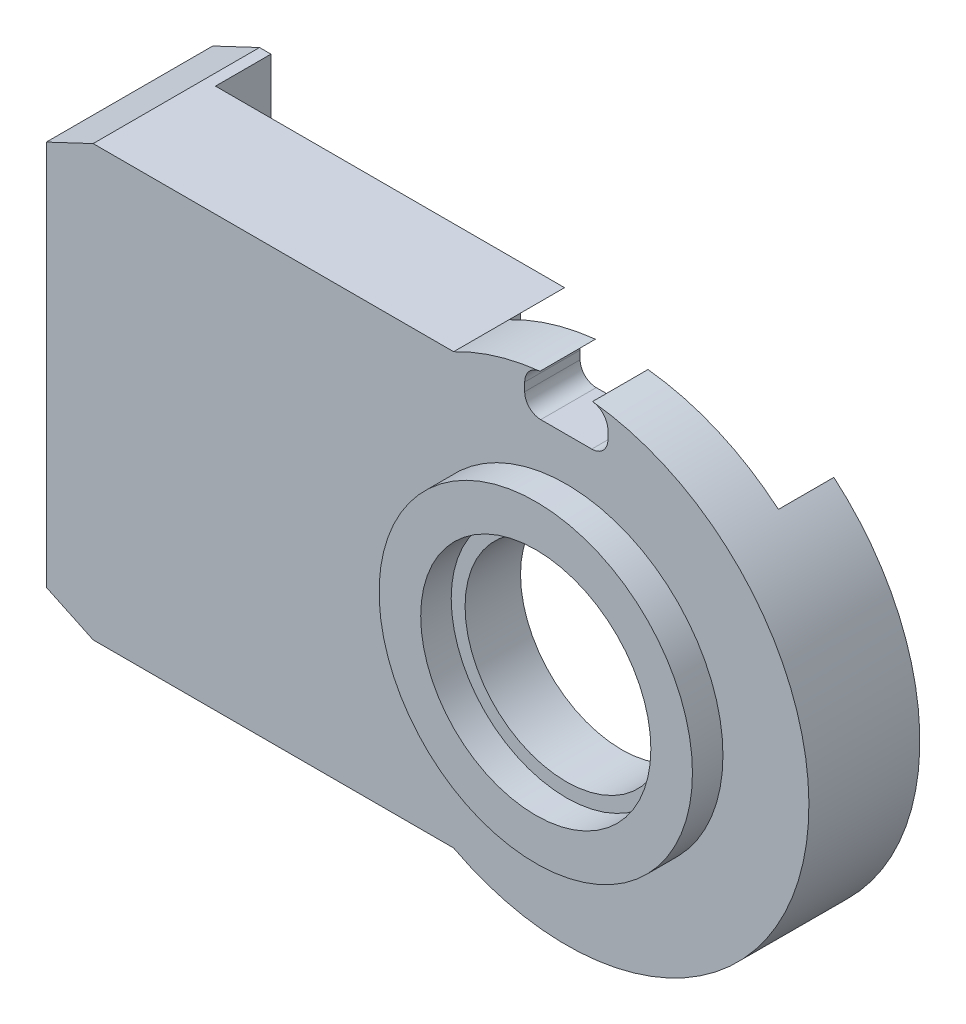
ISO-10303-21;
HEADER;
FILE_DESCRIPTION(('STEP AP214'),'2;1');
FILE_NAME('part.step','',(''),(''),'','','');
FILE_SCHEMA(('AUTOMOTIVE_DESIGN { 1 0 10303 214 1 1 1 1 }'));
ENDSEC;
DATA;
#1=APPLICATION_CONTEXT('core data for automotive mechanical design processes');
#2=APPLICATION_PROTOCOL_DEFINITION('international standard','automotive_design',2000,#1);
#3=PRODUCT_CONTEXT('',#1,'mechanical');
#4=PRODUCT('Part','Part','',(#3));
#5=PRODUCT_RELATED_PRODUCT_CATEGORY('part','',(#4));
#6=PRODUCT_DEFINITION_FORMATION('','',#4);
#7=PRODUCT_DEFINITION_CONTEXT('part definition',#1,'design');
#8=PRODUCT_DEFINITION('design','',#6,#7);
#9=PRODUCT_DEFINITION_SHAPE('','',#8);
#10=(LENGTH_UNIT() NAMED_UNIT(*) SI_UNIT(.MILLI.,.METRE.));
#11=(NAMED_UNIT(*) PLANE_ANGLE_UNIT() SI_UNIT($,.RADIAN.));
#12=(NAMED_UNIT(*) SI_UNIT($,.STERADIAN.) SOLID_ANGLE_UNIT());
#13=UNCERTAINTY_MEASURE_WITH_UNIT(LENGTH_MEASURE(1.E-05),#10,'distance_accuracy_value','');
#14=(GEOMETRIC_REPRESENTATION_CONTEXT(3) GLOBAL_UNCERTAINTY_ASSIGNED_CONTEXT((#13)) GLOBAL_UNIT_ASSIGNED_CONTEXT((#10,
#11,#12)) REPRESENTATION_CONTEXT('',''));
#15=CARTESIAN_POINT('',(0.,0.,0.));
#16=DIRECTION('',(0.,0.,1.));
#17=DIRECTION('',(1.,0.,0.));
#18=AXIS2_PLACEMENT_3D('',#15,#16,#17);
#19=CARTESIAN_POINT('',(0.,0.,4.));
#20=DIRECTION('',(0.,0.,1.));
#21=DIRECTION('',(1.,0.,0.));
#22=AXIS2_PLACEMENT_3D('',#19,#20,#21);
#23=PLANE('',#22);
#24=CARTESIAN_POINT('',(0.,0.,4.));
#25=DIRECTION('',(0.,0.,1.));
#26=DIRECTION('',(1.,0.,0.));
#27=AXIS2_PLACEMENT_3D('',#24,#25,#26);
#28=CIRCLE('',#27,3.65);
#29=CARTESIAN_POINT('',(3.65,0.,4.));
#30=VERTEX_POINT('',#29);
#31=EDGE_CURVE('E361',#30,#30,#28,.T.);
#32=ORIENTED_EDGE('',*,*,#31,.F.);
#33=EDGE_LOOP('',(#32));
#34=FACE_BOUND('',#33,.T.);
#35=CARTESIAN_POINT('',(0.,0.,4.));
#36=DIRECTION('',(0.,0.,1.));
#37=DIRECTION('',(1.,0.,0.));
#38=AXIS2_PLACEMENT_3D('',#35,#36,#37);
#39=CIRCLE('',#38,4.15);
#40=CARTESIAN_POINT('',(4.15,0.,4.));
#41=VERTEX_POINT('',#40);
#42=EDGE_CURVE('E12',#41,#41,#39,.F.);
#43=ORIENTED_EDGE('',*,*,#42,.F.);
#44=EDGE_LOOP('',(#43));
#45=FACE_BOUND('',#44,.T.);
#46=ADVANCED_FACE('F67',(#34,#45),#23,.T.);
#47=CARTESIAN_POINT('',(0.,0.,0.));
#48=DIRECTION('',(0.,0.,1.));
#49=DIRECTION('',(1.,0.,0.));
#50=AXIS2_PLACEMENT_3D('',#47,#48,#49);
#51=PLANE('',#50);
#52=DIRECTION('',(0.,-1.,0.));
#53=VECTOR('',#52,1.);
#54=CARTESIAN_POINT('',(-16.65,0.,0.));
#55=LINE('',#54,#53);
#56=CARTESIAN_POINT('',(-16.65,7.75,0.));
#57=VERTEX_POINT('',#56);
#58=CARTESIAN_POINT('',(-16.65,-7.75,0.));
#59=VERTEX_POINT('',#58);
#60=EDGE_CURVE('E82',#57,#59,#55,.T.);
#61=ORIENTED_EDGE('',*,*,#60,.F.);
#62=DIRECTION('',(1.,0.,0.));
#63=VECTOR('',#62,1.);
#64=CARTESIAN_POINT('',(0.,7.75,0.));
#65=LINE('',#64,#63);
#66=CARTESIAN_POINT('',(-4.06201920231798,7.75,0.));
#67=VERTEX_POINT('',#66);
#68=EDGE_CURVE('E228',#57,#67,#65,.T.);
#69=ORIENTED_EDGE('',*,*,#68,.T.);
#70=CARTESIAN_POINT('',(0.,0.,0.));
#71=DIRECTION('',(0.,0.,1.));
#72=DIRECTION('',(1.,0.,0.));
#73=AXIS2_PLACEMENT_3D('',#70,#71,#72);
#74=CIRCLE('',#73,8.75);
#75=CARTESIAN_POINT('',(-5.65,6.68131723539603,0.));
#76=VERTEX_POINT('',#75);
#77=EDGE_CURVE('E75',#76,#67,#74,.F.);
#78=ORIENTED_EDGE('',*,*,#77,.F.);
#79=DIRECTION('',(0.,-1.,0.));
#80=VECTOR('',#79,1.);
#81=CARTESIAN_POINT('',(-5.65,0.,0.));
#82=LINE('',#81,#80);
#83=CARTESIAN_POINT('',(-5.65,-6.68131723539603,0.));
#84=VERTEX_POINT('',#83);
#85=EDGE_CURVE('E330',#76,#84,#82,.T.);
#86=ORIENTED_EDGE('',*,*,#85,.T.);
#87=CARTESIAN_POINT('',(0.,0.,0.));
#88=DIRECTION('',(0.,0.,1.));
#89=DIRECTION('',(1.,0.,0.));
#90=AXIS2_PLACEMENT_3D('',#87,#88,#89);
#91=CIRCLE('',#90,8.75);
#92=CARTESIAN_POINT('',(-4.06201920231798,-7.75,0.));
#93=VERTEX_POINT('',#92);
#94=EDGE_CURVE('E313',#84,#93,#91,.T.);
#95=ORIENTED_EDGE('',*,*,#94,.T.);
#96=DIRECTION('',(1.,0.,0.));
#97=VECTOR('',#96,1.);
#98=CARTESIAN_POINT('',(0.,-7.75,0.));
#99=LINE('',#98,#97);
#100=EDGE_CURVE('E365',#59,#93,#99,.T.);
#101=ORIENTED_EDGE('',*,*,#100,.F.);
#102=EDGE_LOOP('',(#61,#69,#78,#86,#95,#101));
#103=FACE_BOUND('',#102,.T.);
#104=ADVANCED_FACE('F408',(#103),#51,.F.);
#105=CARTESIAN_POINT('',(0.,0.,4.));
#106=DIRECTION('',(0.,0.,-1.));
#107=DIRECTION('',(-1.,0.,0.));
#108=AXIS2_PLACEMENT_3D('',#105,#106,#107);
#109=CYLINDRICAL_SURFACE('',#108,8.75);
#110=DIRECTION('',(0.,0.,-1.));
#111=VECTOR('',#110,1.);
#112=CARTESIAN_POINT('',(0.947109471094769,8.69859090024141,4.));
#113=LINE('',#112,#111);
#114=CARTESIAN_POINT('',(0.947109471094769,8.69859090024141,4.));
#115=VERTEX_POINT('',#114);
#116=CARTESIAN_POINT('',(0.947109471094767,8.69859090024141,2.));
#117=VERTEX_POINT('',#116);
#118=EDGE_CURVE('E90',#115,#117,#113,.T.);
#119=ORIENTED_EDGE('',*,*,#118,.F.);
#120=CARTESIAN_POINT('',(0.,0.,4.));
#121=DIRECTION('',(0.,0.,1.));
#122=DIRECTION('',(1.,0.,0.));
#123=AXIS2_PLACEMENT_3D('',#120,#121,#122);
#124=CIRCLE('',#123,8.75);
#125=CARTESIAN_POINT('',(-4.06201920231798,-7.75,4.));
#126=VERTEX_POINT('',#125);
#127=EDGE_CURVE('E355',#126,#115,#124,.T.);
#128=ORIENTED_EDGE('',*,*,#127,.F.);
#129=DIRECTION('',(0.,0.,-1.));
#130=VECTOR('',#129,1.);
#131=CARTESIAN_POINT('',(-4.06201920231798,-7.75,4.));
#132=LINE('',#131,#130);
#133=CARTESIAN_POINT('',(-4.06201920231798,-7.75,2.));
#134=VERTEX_POINT('',#133);
#135=EDGE_CURVE('E374',#126,#134,#132,.T.);
#136=ORIENTED_EDGE('',*,*,#135,.T.);
#137=CARTESIAN_POINT('',(0.,0.,2.));
#138=DIRECTION('',(0.,0.,1.));
#139=DIRECTION('',(1.,0.,0.));
#140=AXIS2_PLACEMENT_3D('',#137,#138,#139);
#141=CIRCLE('',#140,8.75);
#142=CARTESIAN_POINT('',(5.65,-6.68131723539602,2.));
#143=VERTEX_POINT('',#142);
#144=EDGE_CURVE('E324',#134,#143,#141,.T.);
#145=ORIENTED_EDGE('',*,*,#144,.T.);
#146=DIRECTION('',(0.,0.,-1.));
#147=VECTOR('',#146,1.);
#148=CARTESIAN_POINT('',(5.65,-6.68131723539602,2.));
#149=LINE('',#148,#147);
#150=CARTESIAN_POINT('',(5.65,-6.68131723539602,0.));
#151=VERTEX_POINT('',#150);
#152=EDGE_CURVE('E328',#143,#151,#149,.T.);
#153=ORIENTED_EDGE('',*,*,#152,.T.);
#154=CARTESIAN_POINT('',(0.,0.,0.));
#155=DIRECTION('',(0.,0.,1.));
#156=DIRECTION('',(1.,0.,0.));
#157=AXIS2_PLACEMENT_3D('',#154,#155,#156);
#158=CIRCLE('',#157,8.75);
#159=CARTESIAN_POINT('',(5.65,6.68131723539603,0.));
#160=VERTEX_POINT('',#159);
#161=EDGE_CURVE('E367',#151,#160,#158,.T.);
#162=ORIENTED_EDGE('',*,*,#161,.T.);
#163=DIRECTION('',(0.,0.,-1.));
#164=VECTOR('',#163,1.);
#165=CARTESIAN_POINT('',(5.65,6.68131723539603,2.));
#166=LINE('',#165,#164);
#167=CARTESIAN_POINT('',(5.65,6.68131723539603,2.));
#168=VERTEX_POINT('',#167);
#169=EDGE_CURVE('E343',#168,#160,#166,.T.);
#170=ORIENTED_EDGE('',*,*,#169,.F.);
#171=CARTESIAN_POINT('',(0.,0.,2.));
#172=DIRECTION('',(0.,0.,1.));
#173=DIRECTION('',(1.,0.,0.));
#174=AXIS2_PLACEMENT_3D('',#171,#172,#173);
#175=CIRCLE('',#174,8.75);
#176=EDGE_CURVE('E317',#168,#117,#175,.T.);
#177=ORIENTED_EDGE('',*,*,#176,.T.);
#178=EDGE_LOOP('',(#119,#128,#136,#145,#153,#162,#170,#177));
#179=FACE_BOUND('',#178,.T.);
#180=ADVANCED_FACE('F417',(#179),#109,.T.);
#181=CARTESIAN_POINT('',(0.,-7.75,4.));
#182=DIRECTION('',(0.,1.,0.));
#183=DIRECTION('',(0.,0.,1.));
#184=AXIS2_PLACEMENT_3D('',#181,#182,#183);
#185=PLANE('',#184);
#186=DIRECTION('',(0.,0.,-1.));
#187=VECTOR('',#186,1.);
#188=CARTESIAN_POINT('',(-17.062019202318,-7.75,4.));
#189=LINE('',#188,#187);
#190=CARTESIAN_POINT('',(-17.062019202318,-7.75,4.));
#191=VERTEX_POINT('',#190);
#192=CARTESIAN_POINT('',(-17.062019202318,-7.75,-2.));
#193=VERTEX_POINT('',#192);
#194=EDGE_CURVE('E383',#191,#193,#189,.T.);
#195=ORIENTED_EDGE('',*,*,#194,.T.);
#196=DIRECTION('',(1.,0.,0.));
#197=VECTOR('',#196,1.);
#198=CARTESIAN_POINT('',(0.,-7.75,-2.));
#199=LINE('',#198,#197);
#200=CARTESIAN_POINT('',(-16.65,-7.75,-2.));
#201=VERTEX_POINT('',#200);
#202=EDGE_CURVE('E231',#193,#201,#199,.T.);
#203=ORIENTED_EDGE('',*,*,#202,.T.);
#204=DIRECTION('',(0.,0.,1.));
#205=VECTOR('',#204,1.);
#206=CARTESIAN_POINT('',(-16.65,-7.75,-2.));
#207=LINE('',#206,#205);
#208=EDGE_CURVE('E230',#201,#59,#207,.T.);
#209=ORIENTED_EDGE('',*,*,#208,.T.);
#210=ORIENTED_EDGE('',*,*,#100,.T.);
#211=DIRECTION('',(0.,0.,-1.));
#212=VECTOR('',#211,1.);
#213=CARTESIAN_POINT('',(-4.06201920231798,-7.75,2.));
#214=LINE('',#213,#212);
#215=EDGE_CURVE('E345',#134,#93,#214,.T.);
#216=ORIENTED_EDGE('',*,*,#215,.F.);
#217=ORIENTED_EDGE('',*,*,#135,.F.);
#218=DIRECTION('',(1.,0.,0.));
#219=VECTOR('',#218,1.);
#220=CARTESIAN_POINT('',(0.,-7.75,4.));
#221=LINE('',#220,#219);
#222=EDGE_CURVE('E351',#191,#126,#221,.T.);
#223=ORIENTED_EDGE('',*,*,#222,.F.);
#224=EDGE_LOOP('',(#195,#203,#209,#210,#216,#217,#223));
#225=FACE_BOUND('',#224,.T.);
#226=ADVANCED_FACE('F413',(#225),#185,.F.);
#227=CARTESIAN_POINT('',(0.,7.75,4.));
#228=DIRECTION('',(0.,1.,0.));
#229=DIRECTION('',(0.,0.,1.));
#230=AXIS2_PLACEMENT_3D('',#227,#228,#229);
#231=PLANE('',#230);
#232=ORIENTED_EDGE('',*,*,#68,.F.);
#233=DIRECTION('',(0.,0.,1.));
#234=VECTOR('',#233,1.);
#235=CARTESIAN_POINT('',(-16.65,7.75,-2.));
#236=LINE('',#235,#234);
#237=CARTESIAN_POINT('',(-16.65,7.75,-2.));
#238=VERTEX_POINT('',#237);
#239=EDGE_CURVE('E225',#238,#57,#236,.T.);
#240=ORIENTED_EDGE('',*,*,#239,.F.);
#241=DIRECTION('',(1.,0.,0.));
#242=VECTOR('',#241,1.);
#243=CARTESIAN_POINT('',(0.,7.75,-2.));
#244=LINE('',#243,#242);
#245=CARTESIAN_POINT('',(-17.062019202318,7.75,-2.));
#246=VERTEX_POINT('',#245);
#247=EDGE_CURVE('E211',#246,#238,#244,.T.);
#248=ORIENTED_EDGE('',*,*,#247,.F.);
#249=DIRECTION('',(0.,0.,-1.));
#250=VECTOR('',#249,1.);
#251=CARTESIAN_POINT('',(-17.062019202318,7.75,4.));
#252=LINE('',#251,#250);
#253=CARTESIAN_POINT('',(-17.062019202318,7.75,4.));
#254=VERTEX_POINT('',#253);
#255=EDGE_CURVE('E368',#254,#246,#252,.T.);
#256=ORIENTED_EDGE('',*,*,#255,.F.);
#257=DIRECTION('',(1.,0.,0.));
#258=VECTOR('',#257,1.);
#259=CARTESIAN_POINT('',(0.,7.75,4.));
#260=LINE('',#259,#258);
#261=CARTESIAN_POINT('',(-4.06201920231798,7.75,4.));
#262=VERTEX_POINT('',#261);
#263=EDGE_CURVE('E358',#254,#262,#260,.T.);
#264=ORIENTED_EDGE('',*,*,#263,.T.);
#265=DIRECTION('',(0.,0.,-1.));
#266=VECTOR('',#265,1.);
#267=CARTESIAN_POINT('',(-4.06201920231798,7.75,4.));
#268=LINE('',#267,#266);
#269=CARTESIAN_POINT('',(-4.06201920231798,7.75,2.));
#270=VERTEX_POINT('',#269);
#271=EDGE_CURVE('E364',#262,#270,#268,.T.);
#272=ORIENTED_EDGE('',*,*,#271,.T.);
#273=DIRECTION('',(0.,0.,-1.));
#274=VECTOR('',#273,1.);
#275=CARTESIAN_POINT('',(-4.06201920231798,7.75,2.));
#276=LINE('',#275,#274);
#277=EDGE_CURVE('E348',#270,#67,#276,.T.);
#278=ORIENTED_EDGE('',*,*,#277,.T.);
#279=EDGE_LOOP('',(#232,#240,#248,#256,#264,#272,#278));
#280=FACE_BOUND('',#279,.T.);
#281=ADVANCED_FACE('F226',(#280),#231,.T.);
#282=CARTESIAN_POINT('',(0.,0.,4.));
#283=DIRECTION('',(0.,0.,-1.));
#284=DIRECTION('',(-1.,0.,0.));
#285=AXIS2_PLACEMENT_3D('',#282,#283,#284);
#286=CYLINDRICAL_SURFACE('',#285,3.65);
#287=CARTESIAN_POINT('',(0.,0.,2.));
#288=DIRECTION('',(0.,0.,1.));
#289=DIRECTION('',(1.,0.,0.));
#290=AXIS2_PLACEMENT_3D('',#287,#288,#289);
#291=CIRCLE('',#290,3.65);
#292=CARTESIAN_POINT('',(3.65,0.,2.));
#293=VERTEX_POINT('',#292);
#294=EDGE_CURVE('E309',#293,#293,#291,.T.);
#295=ORIENTED_EDGE('',*,*,#294,.F.);
#296=EDGE_LOOP('',(#295));
#297=FACE_BOUND('',#296,.T.);
#298=ORIENTED_EDGE('',*,*,#31,.T.);
#299=EDGE_LOOP('',(#298));
#300=FACE_BOUND('',#299,.T.);
#301=ADVANCED_FACE('F472',(#297,#300),#286,.F.);
#302=CARTESIAN_POINT('',(-0.947109471094651,8.69859090024142,4.));
#303=VERTEX_POINT('',#302);
#304=EDGE_CURVE('E354',#303,#262,#124,.T.);
#305=ORIENTED_EDGE('',*,*,#304,.F.);
#306=DIRECTION('',(0.,0.,-1.));
#307=VECTOR('',#306,1.);
#308=CARTESIAN_POINT('',(-0.947109471094651,8.69859090024142,4.));
#309=LINE('',#308,#307);
#310=CARTESIAN_POINT('',(-0.947109471094651,8.69859090024142,2.));
#311=VERTEX_POINT('',#310);
#312=EDGE_CURVE('E292',#303,#311,#309,.T.);
#313=ORIENTED_EDGE('',*,*,#312,.T.);
#314=EDGE_CURVE('E321',#311,#270,#175,.T.);
#315=ORIENTED_EDGE('',*,*,#314,.T.);
#316=ORIENTED_EDGE('',*,*,#271,.F.);
#317=EDGE_LOOP('',(#305,#313,#315,#316));
#318=FACE_BOUND('',#317,.T.);
#319=ADVANCED_FACE('F399',(#318),#109,.T.);
#320=ORIENTED_EDGE('',*,*,#161,.F.);
#321=DIRECTION('',(0.,-1.,0.));
#322=VECTOR('',#321,1.);
#323=CARTESIAN_POINT('',(5.65,0.,0.));
#324=LINE('',#323,#322);
#325=EDGE_CURVE('E295',#160,#151,#324,.T.);
#326=ORIENTED_EDGE('',*,*,#325,.F.);
#327=EDGE_LOOP('',(#320,#326));
#328=FACE_BOUND('',#327,.T.);
#329=ADVANCED_FACE('F463',(#328),#51,.F.);
#330=CARTESIAN_POINT('',(0.,0.,4.));
#331=DIRECTION('',(0.,0.,1.));
#332=DIRECTION('',(1.,0.,0.));
#333=AXIS2_PLACEMENT_3D('',#330,#331,#332);
#334=CIRCLE('',#333,5.65);
#335=CARTESIAN_POINT('',(5.65,0.,4.));
#336=VERTEX_POINT('',#335);
#337=EDGE_CURVE('E240',#336,#336,#334,.T.);
#338=ORIENTED_EDGE('',*,*,#337,.F.);
#339=EDGE_LOOP('',(#338));
#340=FACE_BOUND('',#339,.T.);
#341=CARTESIAN_POINT('',(-0.879999999999943,8.08223360216717,4.));
#342=DIRECTION('',(0.,0.,-1.));
#343=DIRECTION('',(1.,0.,0.));
#344=AXIS2_PLACEMENT_3D('',#341,#342,#343);
#345=CIRCLE('',#344,0.620000000000002);
#346=CARTESIAN_POINT('',(-1.49999999999995,8.08223360216717,4.));
#347=VERTEX_POINT('',#346);
#348=EDGE_CURVE('E272',#347,#303,#345,.T.);
#349=ORIENTED_EDGE('',*,*,#348,.T.);
#350=ORIENTED_EDGE('',*,*,#304,.T.);
#351=ORIENTED_EDGE('',*,*,#263,.F.);
#352=DIRECTION('',(-0.904313023333706,-0.426869951892907,0.));
#353=VECTOR('',#352,1.);
#354=CARTESIAN_POINT('',(-17.062019202318,7.75,4.));
#355=LINE('',#354,#353);
#356=CARTESIAN_POINT('',(-18.75,6.95320921704035,4.));
#357=VERTEX_POINT('',#356);
#358=EDGE_CURVE('E381',#254,#357,#355,.T.);
#359=ORIENTED_EDGE('',*,*,#358,.T.);
#360=DIRECTION('',(0.,-1.,0.));
#361=VECTOR('',#360,1.);
#362=CARTESIAN_POINT('',(-18.75,6.95320921704035,4.));
#363=LINE('',#362,#361);
#364=CARTESIAN_POINT('',(-18.75,-6.95320921704035,4.));
#365=VERTEX_POINT('',#364);
#366=EDGE_CURVE('E379',#357,#365,#363,.T.);
#367=ORIENTED_EDGE('',*,*,#366,.T.);
#368=DIRECTION('',(-0.904313023333706,0.426869951892907,0.));
#369=VECTOR('',#368,1.);
#370=CARTESIAN_POINT('',(-17.062019202318,-7.75,4.));
#371=LINE('',#370,#369);
#372=EDGE_CURVE('E350',#191,#365,#371,.T.);
#373=ORIENTED_EDGE('',*,*,#372,.F.);
#374=ORIENTED_EDGE('',*,*,#222,.T.);
#375=ORIENTED_EDGE('',*,*,#127,.T.);
#376=CARTESIAN_POINT('',(0.880000000000052,8.08223360216716,4.));
#377=DIRECTION('',(0.,0.,-1.));
#378=DIRECTION('',(-1.,0.,0.));
#379=AXIS2_PLACEMENT_3D('',#376,#377,#378);
#380=CIRCLE('',#379,0.620000000000003);
#381=CARTESIAN_POINT('',(1.50000000000005,8.08223360216716,4.));
#382=VERTEX_POINT('',#381);
#383=EDGE_CURVE('E253',#115,#382,#380,.T.);
#384=ORIENTED_EDGE('',*,*,#383,.T.);
#385=DIRECTION('',(0.,-1.,0.));
#386=VECTOR('',#385,1.);
#387=CARTESIAN_POINT('',(1.50000000000005,7.77999999999999,4.));
#388=LINE('',#387,#386);
#389=CARTESIAN_POINT('',(1.50000000000005,7.77999999999999,4.));
#390=VERTEX_POINT('',#389);
#391=EDGE_CURVE('E256',#382,#390,#388,.T.);
#392=ORIENTED_EDGE('',*,*,#391,.T.);
#393=CARTESIAN_POINT('',(0.920000000000056,7.77999999999999,4.));
#394=DIRECTION('',(0.,0.,-1.));
#395=DIRECTION('',(-1.,0.,0.));
#396=AXIS2_PLACEMENT_3D('',#393,#394,#395);
#397=CIRCLE('',#396,0.579999999999998);
#398=CARTESIAN_POINT('',(0.920000000000056,7.2,4.));
#399=VERTEX_POINT('',#398);
#400=EDGE_CURVE('E260',#390,#399,#397,.T.);
#401=ORIENTED_EDGE('',*,*,#400,.T.);
#402=DIRECTION('',(-1.,0.,0.));
#403=VECTOR('',#402,1.);
#404=CARTESIAN_POINT('',(-0.919999999999948,7.2,4.));
#405=LINE('',#404,#403);
#406=CARTESIAN_POINT('',(-0.919999999999948,7.2,4.));
#407=VERTEX_POINT('',#406);
#408=EDGE_CURVE('E263',#399,#407,#405,.T.);
#409=ORIENTED_EDGE('',*,*,#408,.T.);
#410=CARTESIAN_POINT('',(-0.919999999999948,7.77999999999999,4.));
#411=DIRECTION('',(0.,0.,-1.));
#412=DIRECTION('',(1.,0.,0.));
#413=AXIS2_PLACEMENT_3D('',#410,#411,#412);
#414=CIRCLE('',#413,0.579999999999998);
#415=CARTESIAN_POINT('',(-1.49999999999995,7.77999999999999,4.));
#416=VERTEX_POINT('',#415);
#417=EDGE_CURVE('E266',#407,#416,#414,.T.);
#418=ORIENTED_EDGE('',*,*,#417,.T.);
#419=DIRECTION('',(0.,1.,0.));
#420=VECTOR('',#419,1.);
#421=CARTESIAN_POINT('',(-1.49999999999995,7.77999999999999,4.));
#422=LINE('',#421,#420);
#423=EDGE_CURVE('E269',#416,#347,#422,.T.);
#424=ORIENTED_EDGE('',*,*,#423,.T.);
#425=EDGE_LOOP('',(#349,#350,#351,#359,#367,#373,#374,#375,#384,#392,#401,#409,#418,#424));
#426=FACE_BOUND('',#425,.T.);
#427=ADVANCED_FACE('F420',(#340,#426),#23,.T.);
#428=CARTESIAN_POINT('',(-17.062019202318,7.75,4.));
#429=DIRECTION('',(0.426869951892907,-0.904313023333706,0.));
#430=DIRECTION('',(0.904313023333706,0.426869951892907,0.));
#431=AXIS2_PLACEMENT_3D('',#428,#429,#430);
#432=PLANE('',#431);
#433=ORIENTED_EDGE('',*,*,#255,.T.);
#434=DIRECTION('',(-0.904313023333706,-0.426869951892907,0.));
#435=VECTOR('',#434,1.);
#436=CARTESIAN_POINT('',(-6.10069270130348,12.9241607114331,-2.));
#437=LINE('',#436,#435);
#438=CARTESIAN_POINT('',(-18.75,6.95320921704035,-2.));
#439=VERTEX_POINT('',#438);
#440=EDGE_CURVE('E220',#246,#439,#437,.T.);
#441=ORIENTED_EDGE('',*,*,#440,.T.);
#442=DIRECTION('',(0.,0.,-1.));
#443=VECTOR('',#442,1.);
#444=CARTESIAN_POINT('',(-18.75,6.95320921704035,4.));
#445=LINE('',#444,#443);
#446=EDGE_CURVE('E385',#357,#439,#445,.T.);
#447=ORIENTED_EDGE('',*,*,#446,.F.);
#448=ORIENTED_EDGE('',*,*,#358,.F.);
#449=EDGE_LOOP('',(#433,#441,#447,#448));
#450=FACE_BOUND('',#449,.T.);
#451=ADVANCED_FACE('F431',(#450),#432,.F.);
#452=CARTESIAN_POINT('',(-18.75,6.95320921704035,4.));
#453=DIRECTION('',(1.,0.,0.));
#454=DIRECTION('',(0.,0.,-1.));
#455=AXIS2_PLACEMENT_3D('',#452,#453,#454);
#456=PLANE('',#455);
#457=ORIENTED_EDGE('',*,*,#446,.T.);
#458=DIRECTION('',(0.,-1.,0.));
#459=VECTOR('',#458,1.);
#460=CARTESIAN_POINT('',(-18.75,0.,-2.));
#461=LINE('',#460,#459);
#462=CARTESIAN_POINT('',(-18.75,-6.95320921704035,-2.));
#463=VERTEX_POINT('',#462);
#464=EDGE_CURVE('E244',#439,#463,#461,.T.);
#465=ORIENTED_EDGE('',*,*,#464,.T.);
#466=DIRECTION('',(0.,0.,-1.));
#467=VECTOR('',#466,1.);
#468=CARTESIAN_POINT('',(-18.75,-6.95320921704035,4.));
#469=LINE('',#468,#467);
#470=EDGE_CURVE('E387',#365,#463,#469,.T.);
#471=ORIENTED_EDGE('',*,*,#470,.F.);
#472=ORIENTED_EDGE('',*,*,#366,.F.);
#473=EDGE_LOOP('',(#457,#465,#471,#472));
#474=FACE_BOUND('',#473,.T.);
#475=ADVANCED_FACE('F426',(#474),#456,.F.);
#476=CARTESIAN_POINT('',(-17.062019202318,-7.75,4.));
#477=DIRECTION('',(-0.426869951892907,-0.904313023333706,0.));
#478=DIRECTION('',(0.904313023333706,-0.426869951892907,0.));
#479=AXIS2_PLACEMENT_3D('',#476,#477,#478);
#480=PLANE('',#479);
#481=ORIENTED_EDGE('',*,*,#470,.T.);
#482=DIRECTION('',(-0.904313023333706,0.426869951892907,0.));
#483=VECTOR('',#482,1.);
#484=CARTESIAN_POINT('',(-6.10069270130348,-12.9241607114331,-2.));
#485=LINE('',#484,#483);
#486=EDGE_CURVE('E247',#193,#463,#485,.T.);
#487=ORIENTED_EDGE('',*,*,#486,.F.);
#488=ORIENTED_EDGE('',*,*,#194,.F.);
#489=ORIENTED_EDGE('',*,*,#372,.T.);
#490=EDGE_LOOP('',(#481,#487,#488,#489));
#491=FACE_BOUND('',#490,.T.);
#492=ADVANCED_FACE('F69',(#491),#480,.T.);
#493=CARTESIAN_POINT('',(0.,0.,2.));
#494=DIRECTION('',(0.,0.,-1.));
#495=DIRECTION('',(-1.,0.,0.));
#496=AXIS2_PLACEMENT_3D('',#493,#494,#495);
#497=CYLINDRICAL_SURFACE('',#496,8.75);
#498=ORIENTED_EDGE('',*,*,#215,.T.);
#499=ORIENTED_EDGE('',*,*,#94,.F.);
#500=DIRECTION('',(0.,0.,-1.));
#501=VECTOR('',#500,1.);
#502=CARTESIAN_POINT('',(-5.65,-6.68131723539603,2.));
#503=LINE('',#502,#501);
#504=CARTESIAN_POINT('',(-5.65,-6.68131723539603,2.));
#505=VERTEX_POINT('',#504);
#506=EDGE_CURVE('E337',#505,#84,#503,.T.);
#507=ORIENTED_EDGE('',*,*,#506,.F.);
#508=EDGE_CURVE('E325',#505,#134,#141,.T.);
#509=ORIENTED_EDGE('',*,*,#508,.T.);
#510=EDGE_LOOP('',(#498,#499,#507,#509));
#511=FACE_BOUND('',#510,.T.);
#512=ADVANCED_FACE('F410',(#511),#497,.F.);
#513=CARTESIAN_POINT('',(5.65,0.,2.));
#514=DIRECTION('',(1.,0.,0.));
#515=DIRECTION('',(0.,0.,-1.));
#516=AXIS2_PLACEMENT_3D('',#513,#514,#515);
#517=PLANE('',#516);
#518=ORIENTED_EDGE('',*,*,#325,.T.);
#519=ORIENTED_EDGE('',*,*,#152,.F.);
#520=DIRECTION('',(0.,-1.,0.));
#521=VECTOR('',#520,1.);
#522=CARTESIAN_POINT('',(5.65,0.,2.));
#523=LINE('',#522,#521);
#524=EDGE_CURVE('E312',#168,#143,#523,.T.);
#525=ORIENTED_EDGE('',*,*,#524,.F.);
#526=ORIENTED_EDGE('',*,*,#169,.T.);
#527=EDGE_LOOP('',(#518,#519,#525,#526));
#528=FACE_BOUND('',#527,.T.);
#529=ADVANCED_FACE('F461',(#528),#517,.F.);
#530=CARTESIAN_POINT('',(0.,0.,2.));
#531=DIRECTION('',(0.,0.,-1.));
#532=DIRECTION('',(-1.,0.,0.));
#533=AXIS2_PLACEMENT_3D('',#530,#531,#532);
#534=CYLINDRICAL_SURFACE('',#533,8.75);
#535=CARTESIAN_POINT('',(-5.65,6.68131723539603,2.));
#536=VERTEX_POINT('',#535);
#537=EDGE_CURVE('E316',#270,#536,#175,.T.);
#538=ORIENTED_EDGE('',*,*,#537,.T.);
#539=DIRECTION('',(0.,0.,-1.));
#540=VECTOR('',#539,1.);
#541=CARTESIAN_POINT('',(-5.65,6.68131723539603,2.));
#542=LINE('',#541,#540);
#543=EDGE_CURVE('E340',#536,#76,#542,.T.);
#544=ORIENTED_EDGE('',*,*,#543,.T.);
#545=ORIENTED_EDGE('',*,*,#77,.T.);
#546=ORIENTED_EDGE('',*,*,#277,.F.);
#547=EDGE_LOOP('',(#538,#544,#545,#546));
#548=FACE_BOUND('',#547,.T.);
#549=ADVANCED_FACE('F393',(#548),#534,.F.);
#550=CARTESIAN_POINT('',(-5.65,0.,2.));
#551=DIRECTION('',(1.,0.,0.));
#552=DIRECTION('',(0.,0.,-1.));
#553=AXIS2_PLACEMENT_3D('',#550,#551,#552);
#554=PLANE('',#553);
#555=ORIENTED_EDGE('',*,*,#85,.F.);
#556=ORIENTED_EDGE('',*,*,#543,.F.);
#557=DIRECTION('',(0.,-1.,0.));
#558=VECTOR('',#557,1.);
#559=CARTESIAN_POINT('',(-5.65,0.,2.));
#560=LINE('',#559,#558);
#561=EDGE_CURVE('E320',#536,#505,#560,.T.);
#562=ORIENTED_EDGE('',*,*,#561,.T.);
#563=ORIENTED_EDGE('',*,*,#506,.T.);
#564=EDGE_LOOP('',(#555,#556,#562,#563));
#565=FACE_BOUND('',#564,.T.);
#566=ADVANCED_FACE('F407',(#565),#554,.T.);
#567=CARTESIAN_POINT('',(0.,0.,2.));
#568=DIRECTION('',(0.,0.,1.));
#569=DIRECTION('',(1.,0.,0.));
#570=AXIS2_PLACEMENT_3D('',#567,#568,#569);
#571=PLANE('',#570);
#572=ORIENTED_EDGE('',*,*,#294,.T.);
#573=EDGE_LOOP('',(#572));
#574=FACE_BOUND('',#573,.T.);
#575=ORIENTED_EDGE('',*,*,#314,.F.);
#576=CARTESIAN_POINT('',(-0.879999999999943,8.08223360216717,2.));
#577=DIRECTION('',(0.,0.,-1.));
#578=DIRECTION('',(1.,0.,0.));
#579=AXIS2_PLACEMENT_3D('',#576,#577,#578);
#580=CIRCLE('',#579,0.620000000000002);
#581=CARTESIAN_POINT('',(-1.49999999999995,8.08223360216717,2.));
#582=VERTEX_POINT('',#581);
#583=EDGE_CURVE('E257',#582,#311,#580,.T.);
#584=ORIENTED_EDGE('',*,*,#583,.F.);
#585=DIRECTION('',(0.,1.,0.));
#586=VECTOR('',#585,1.);
#587=CARTESIAN_POINT('',(-1.49999999999995,7.77999999999999,2.));
#588=LINE('',#587,#586);
#589=CARTESIAN_POINT('',(-1.49999999999995,7.77999999999999,2.));
#590=VERTEX_POINT('',#589);
#591=EDGE_CURVE('E288',#590,#582,#588,.T.);
#592=ORIENTED_EDGE('',*,*,#591,.F.);
#593=CARTESIAN_POINT('',(-0.919999999999948,7.77999999999999,2.));
#594=DIRECTION('',(0.,0.,-1.));
#595=DIRECTION('',(1.,0.,0.));
#596=AXIS2_PLACEMENT_3D('',#593,#594,#595);
#597=CIRCLE('',#596,0.579999999999998);
#598=CARTESIAN_POINT('',(-0.919999999999948,7.2,2.));
#599=VERTEX_POINT('',#598);
#600=EDGE_CURVE('E285',#599,#590,#597,.T.);
#601=ORIENTED_EDGE('',*,*,#600,.F.);
#602=DIRECTION('',(-1.,0.,0.));
#603=VECTOR('',#602,1.);
#604=CARTESIAN_POINT('',(-0.919999999999948,7.2,2.));
#605=LINE('',#604,#603);
#606=CARTESIAN_POINT('',(0.920000000000056,7.2,2.));
#607=VERTEX_POINT('',#606);
#608=EDGE_CURVE('E282',#607,#599,#605,.T.);
#609=ORIENTED_EDGE('',*,*,#608,.F.);
#610=CARTESIAN_POINT('',(0.920000000000056,7.77999999999999,2.));
#611=DIRECTION('',(0.,0.,-1.));
#612=DIRECTION('',(-1.,0.,0.));
#613=AXIS2_PLACEMENT_3D('',#610,#611,#612);
#614=CIRCLE('',#613,0.579999999999998);
#615=CARTESIAN_POINT('',(1.50000000000005,7.77999999999999,2.));
#616=VERTEX_POINT('',#615);
#617=EDGE_CURVE('E279',#616,#607,#614,.T.);
#618=ORIENTED_EDGE('',*,*,#617,.F.);
#619=DIRECTION('',(0.,-1.,0.));
#620=VECTOR('',#619,1.);
#621=CARTESIAN_POINT('',(1.50000000000005,7.77999999999999,2.));
#622=LINE('',#621,#620);
#623=CARTESIAN_POINT('',(1.50000000000005,8.08223360216716,2.));
#624=VERTEX_POINT('',#623);
#625=EDGE_CURVE('E276',#624,#616,#622,.T.);
#626=ORIENTED_EDGE('',*,*,#625,.F.);
#627=CARTESIAN_POINT('',(0.880000000000052,8.08223360216716,2.));
#628=DIRECTION('',(0.,0.,-1.));
#629=DIRECTION('',(-1.,0.,0.));
#630=AXIS2_PLACEMENT_3D('',#627,#628,#629);
#631=CIRCLE('',#630,0.620000000000003);
#632=EDGE_CURVE('E251',#117,#624,#631,.T.);
#633=ORIENTED_EDGE('',*,*,#632,.F.);
#634=ORIENTED_EDGE('',*,*,#176,.F.);
#635=ORIENTED_EDGE('',*,*,#524,.T.);
#636=ORIENTED_EDGE('',*,*,#144,.F.);
#637=ORIENTED_EDGE('',*,*,#508,.F.);
#638=ORIENTED_EDGE('',*,*,#561,.F.);
#639=ORIENTED_EDGE('',*,*,#537,.F.);
#640=EDGE_LOOP('',(#575,#584,#592,#601,#609,#618,#626,#633,#634,#635,#636,#637,#638,#639));
#641=FACE_BOUND('',#640,.T.);
#642=ADVANCED_FACE('F404',(#574,#641),#571,.F.);
#643=CARTESIAN_POINT('',(-0.879999999999943,8.08223360216717,4.));
#644=DIRECTION('',(0.,0.,-1.));
#645=DIRECTION('',(-1.,0.,0.));
#646=AXIS2_PLACEMENT_3D('',#643,#644,#645);
#647=CYLINDRICAL_SURFACE('',#646,0.620000000000002);
#648=ORIENTED_EDGE('',*,*,#583,.T.);
#649=ORIENTED_EDGE('',*,*,#312,.F.);
#650=ORIENTED_EDGE('',*,*,#348,.F.);
#651=DIRECTION('',(0.,0.,-1.));
#652=VECTOR('',#651,1.);
#653=CARTESIAN_POINT('',(-1.49999999999995,8.08223360216717,4.));
#654=LINE('',#653,#652);
#655=EDGE_CURVE('E296',#347,#582,#654,.T.);
#656=ORIENTED_EDGE('',*,*,#655,.T.);
#657=EDGE_LOOP('',(#648,#649,#650,#656));
#658=FACE_BOUND('',#657,.T.);
#659=ADVANCED_FACE('F435',(#658),#647,.F.);
#660=CARTESIAN_POINT('',(-1.49999999999995,7.77999999999999,4.));
#661=DIRECTION('',(-1.,0.,0.));
#662=DIRECTION('',(0.,0.,1.));
#663=AXIS2_PLACEMENT_3D('',#660,#661,#662);
#664=PLANE('',#663);
#665=ORIENTED_EDGE('',*,*,#591,.T.);
#666=ORIENTED_EDGE('',*,*,#655,.F.);
#667=ORIENTED_EDGE('',*,*,#423,.F.);
#668=DIRECTION('',(0.,0.,-1.));
#669=VECTOR('',#668,1.);
#670=CARTESIAN_POINT('',(-1.49999999999995,7.77999999999999,4.));
#671=LINE('',#670,#669);
#672=EDGE_CURVE('E298',#416,#590,#671,.T.);
#673=ORIENTED_EDGE('',*,*,#672,.T.);
#674=EDGE_LOOP('',(#665,#666,#667,#673));
#675=FACE_BOUND('',#674,.T.);
#676=ADVANCED_FACE('F440',(#675),#664,.F.);
#677=CARTESIAN_POINT('',(-0.919999999999948,7.77999999999999,4.));
#678=DIRECTION('',(0.,0.,-1.));
#679=DIRECTION('',(-1.,0.,0.));
#680=AXIS2_PLACEMENT_3D('',#677,#678,#679);
#681=CYLINDRICAL_SURFACE('',#680,0.579999999999998);
#682=ORIENTED_EDGE('',*,*,#600,.T.);
#683=ORIENTED_EDGE('',*,*,#672,.F.);
#684=ORIENTED_EDGE('',*,*,#417,.F.);
#685=DIRECTION('',(0.,0.,-1.));
#686=VECTOR('',#685,1.);
#687=CARTESIAN_POINT('',(-0.919999999999948,7.2,4.));
#688=LINE('',#687,#686);
#689=EDGE_CURVE('E300',#407,#599,#688,.T.);
#690=ORIENTED_EDGE('',*,*,#689,.T.);
#691=EDGE_LOOP('',(#682,#683,#684,#690));
#692=FACE_BOUND('',#691,.T.);
#693=ADVANCED_FACE('F443',(#692),#681,.F.);
#694=CARTESIAN_POINT('',(-0.919999999999948,7.2,4.));
#695=DIRECTION('',(0.,-1.,0.));
#696=DIRECTION('',(0.,0.,-1.));
#697=AXIS2_PLACEMENT_3D('',#694,#695,#696);
#698=PLANE('',#697);
#699=ORIENTED_EDGE('',*,*,#608,.T.);
#700=ORIENTED_EDGE('',*,*,#689,.F.);
#701=ORIENTED_EDGE('',*,*,#408,.F.);
#702=DIRECTION('',(0.,0.,-1.));
#703=VECTOR('',#702,1.);
#704=CARTESIAN_POINT('',(0.920000000000056,7.2,4.));
#705=LINE('',#704,#703);
#706=EDGE_CURVE('E302',#399,#607,#705,.T.);
#707=ORIENTED_EDGE('',*,*,#706,.T.);
#708=EDGE_LOOP('',(#699,#700,#701,#707));
#709=FACE_BOUND('',#708,.T.);
#710=ADVANCED_FACE('F446',(#709),#698,.F.);
#711=CARTESIAN_POINT('',(0.920000000000056,7.77999999999999,4.));
#712=DIRECTION('',(0.,0.,-1.));
#713=DIRECTION('',(-1.,0.,0.));
#714=AXIS2_PLACEMENT_3D('',#711,#712,#713);
#715=CYLINDRICAL_SURFACE('',#714,0.579999999999998);
#716=ORIENTED_EDGE('',*,*,#617,.T.);
#717=ORIENTED_EDGE('',*,*,#706,.F.);
#718=ORIENTED_EDGE('',*,*,#400,.F.);
#719=DIRECTION('',(0.,0.,-1.));
#720=VECTOR('',#719,1.);
#721=CARTESIAN_POINT('',(1.50000000000005,7.77999999999999,4.));
#722=LINE('',#721,#720);
#723=EDGE_CURVE('E304',#390,#616,#722,.T.);
#724=ORIENTED_EDGE('',*,*,#723,.T.);
#725=EDGE_LOOP('',(#716,#717,#718,#724));
#726=FACE_BOUND('',#725,.T.);
#727=ADVANCED_FACE('F450',(#726),#715,.F.);
#728=CARTESIAN_POINT('',(1.50000000000005,7.77999999999999,4.));
#729=DIRECTION('',(1.,0.,0.));
#730=DIRECTION('',(0.,0.,-1.));
#731=AXIS2_PLACEMENT_3D('',#728,#729,#730);
#732=PLANE('',#731);
#733=ORIENTED_EDGE('',*,*,#625,.T.);
#734=ORIENTED_EDGE('',*,*,#723,.F.);
#735=ORIENTED_EDGE('',*,*,#391,.F.);
#736=DIRECTION('',(0.,0.,-1.));
#737=VECTOR('',#736,1.);
#738=CARTESIAN_POINT('',(1.50000000000005,8.08223360216716,4.));
#739=LINE('',#738,#737);
#740=EDGE_CURVE('E306',#382,#624,#739,.T.);
#741=ORIENTED_EDGE('',*,*,#740,.T.);
#742=EDGE_LOOP('',(#733,#734,#735,#741));
#743=FACE_BOUND('',#742,.T.);
#744=ADVANCED_FACE('F454',(#743),#732,.F.);
#745=CARTESIAN_POINT('',(0.880000000000052,8.08223360216716,4.));
#746=DIRECTION('',(0.,0.,-1.));
#747=DIRECTION('',(-1.,0.,0.));
#748=AXIS2_PLACEMENT_3D('',#745,#746,#747);
#749=CYLINDRICAL_SURFACE('',#748,0.620000000000003);
#750=ORIENTED_EDGE('',*,*,#632,.T.);
#751=ORIENTED_EDGE('',*,*,#740,.F.);
#752=ORIENTED_EDGE('',*,*,#383,.F.);
#753=ORIENTED_EDGE('',*,*,#118,.T.);
#754=EDGE_LOOP('',(#750,#751,#752,#753));
#755=FACE_BOUND('',#754,.T.);
#756=ADVANCED_FACE('F455',(#755),#749,.F.);
#757=CARTESIAN_POINT('',(-16.65,0.,-2.));
#758=DIRECTION('',(-1.,0.,0.));
#759=DIRECTION('',(0.,0.,1.));
#760=AXIS2_PLACEMENT_3D('',#757,#758,#759);
#761=PLANE('',#760);
#762=ORIENTED_EDGE('',*,*,#60,.T.);
#763=ORIENTED_EDGE('',*,*,#208,.F.);
#764=DIRECTION('',(0.,-1.,0.));
#765=VECTOR('',#764,1.);
#766=CARTESIAN_POINT('',(-16.65,0.,-2.));
#767=LINE('',#766,#765);
#768=EDGE_CURVE('E216',#238,#201,#767,.T.);
#769=ORIENTED_EDGE('',*,*,#768,.F.);
#770=ORIENTED_EDGE('',*,*,#239,.T.);
#771=EDGE_LOOP('',(#762,#763,#769,#770));
#772=FACE_BOUND('',#771,.T.);
#773=ADVANCED_FACE('F233',(#772),#761,.F.);
#774=CARTESIAN_POINT('',(0.,0.,-2.));
#775=DIRECTION('',(0.,0.,1.));
#776=DIRECTION('',(1.,0.,0.));
#777=AXIS2_PLACEMENT_3D('',#774,#775,#776);
#778=PLANE('',#777);
#779=ORIENTED_EDGE('',*,*,#768,.T.);
#780=ORIENTED_EDGE('',*,*,#202,.F.);
#781=ORIENTED_EDGE('',*,*,#486,.T.);
#782=ORIENTED_EDGE('',*,*,#464,.F.);
#783=ORIENTED_EDGE('',*,*,#440,.F.);
#784=ORIENTED_EDGE('',*,*,#247,.T.);
#785=EDGE_LOOP('',(#779,#780,#781,#782,#783,#784));
#786=FACE_BOUND('',#785,.T.);
#787=ADVANCED_FACE('F213',(#786),#778,.F.);
#788=CARTESIAN_POINT('',(0.,0.,5.1));
#789=DIRECTION('',(0.,0.,-1.));
#790=DIRECTION('',(-1.,0.,0.));
#791=AXIS2_PLACEMENT_3D('',#788,#789,#790);
#792=CYLINDRICAL_SURFACE('',#791,4.15);
#793=CARTESIAN_POINT('',(0.,0.,5.1));
#794=DIRECTION('',(0.,0.,1.));
#795=DIRECTION('',(1.,0.,0.));
#796=AXIS2_PLACEMENT_3D('',#793,#794,#795);
#797=CIRCLE('',#796,4.15);
#798=CARTESIAN_POINT('',(4.15,0.,5.1));
#799=VERTEX_POINT('',#798);
#800=EDGE_CURVE('E528',#799,#799,#797,.T.);
#801=ORIENTED_EDGE('',*,*,#800,.T.);
#802=EDGE_LOOP('',(#801));
#803=FACE_BOUND('',#802,.T.);
#804=ORIENTED_EDGE('',*,*,#42,.T.);
#805=EDGE_LOOP('',(#804));
#806=FACE_BOUND('',#805,.T.);
#807=ADVANCED_FACE('F512',(#803,#806),#792,.F.);
#808=CARTESIAN_POINT('',(0.,0.,5.1));
#809=DIRECTION('',(0.,0.,-1.));
#810=DIRECTION('',(-1.,0.,0.));
#811=AXIS2_PLACEMENT_3D('',#808,#809,#810);
#812=CYLINDRICAL_SURFACE('',#811,5.65);
#813=CARTESIAN_POINT('',(0.,0.,5.1));
#814=DIRECTION('',(0.,0.,1.));
#815=DIRECTION('',(1.,0.,0.));
#816=AXIS2_PLACEMENT_3D('',#813,#814,#815);
#817=CIRCLE('',#816,5.65);
#818=CARTESIAN_POINT('',(5.65,0.,5.1));
#819=VERTEX_POINT('',#818);
#820=EDGE_CURVE('E237',#819,#819,#817,.T.);
#821=ORIENTED_EDGE('',*,*,#820,.F.);
#822=EDGE_LOOP('',(#821));
#823=FACE_BOUND('',#822,.T.);
#824=ORIENTED_EDGE('',*,*,#337,.T.);
#825=EDGE_LOOP('',(#824));
#826=FACE_BOUND('',#825,.T.);
#827=ADVANCED_FACE('F515',(#823,#826),#812,.T.);
#828=CARTESIAN_POINT('',(0.,0.,5.1));
#829=DIRECTION('',(0.,0.,1.));
#830=DIRECTION('',(1.,0.,0.));
#831=AXIS2_PLACEMENT_3D('',#828,#829,#830);
#832=PLANE('',#831);
#833=ORIENTED_EDGE('',*,*,#800,.F.);
#834=EDGE_LOOP('',(#833));
#835=FACE_BOUND('',#834,.T.);
#836=ORIENTED_EDGE('',*,*,#820,.T.);
#837=EDGE_LOOP('',(#836));
#838=FACE_BOUND('',#837,.T.);
#839=ADVANCED_FACE('F519',(#835,#838),#832,.T.);
#840=CLOSED_SHELL('',(#46,#104,#180,#226,#281,#301,#319,#329,#427,#451,#475,#492,#512,#529,#549,
#566,#642,#659,#676,#693,#710,#727,#744,#756,#773,#787,#807,#827,#839));
#841=MANIFOLD_SOLID_BREP('B2',#840);
#842=ADVANCED_BREP_SHAPE_REPRESENTATION('',(#18,#841),#14);
#843=SHAPE_DEFINITION_REPRESENTATION(#9,#842);
ENDSEC;
END-ISO-10303-21;
